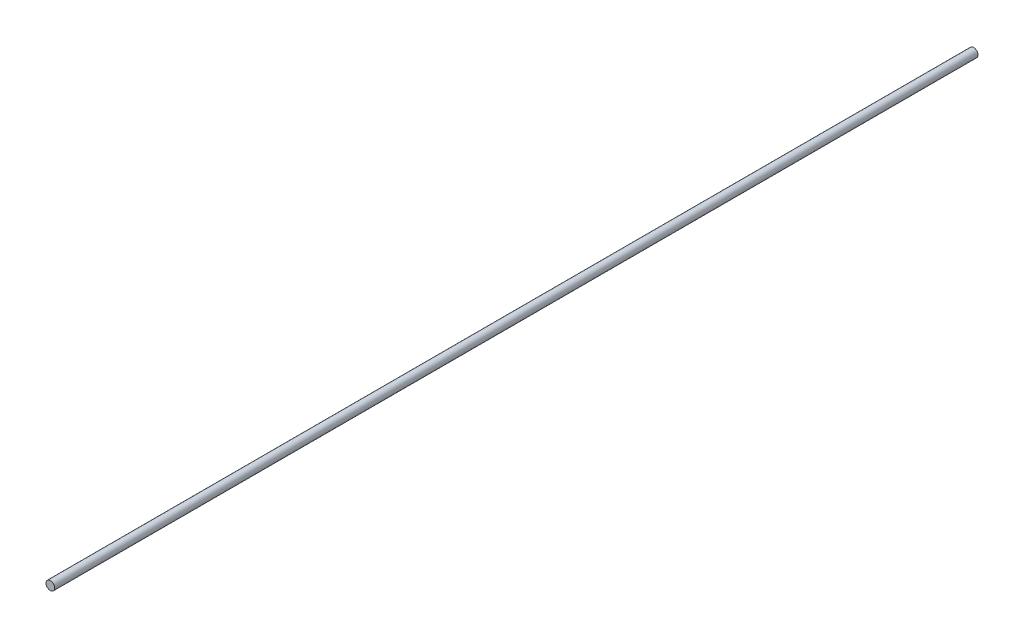
ISO-10303-21;
HEADER;
FILE_DESCRIPTION(('STEP AP214'),'2;1');
FILE_NAME('part.step','',(''),(''),'','','');
FILE_SCHEMA(('AUTOMOTIVE_DESIGN { 1 0 10303 214 1 1 1 1 }'));
ENDSEC;
DATA;
#1=APPLICATION_CONTEXT('core data for automotive mechanical design processes');
#2=APPLICATION_PROTOCOL_DEFINITION('international standard','automotive_design',2000,#1);
#3=PRODUCT_CONTEXT('',#1,'mechanical');
#4=PRODUCT('Part','Part','',(#3));
#5=PRODUCT_RELATED_PRODUCT_CATEGORY('part','',(#4));
#6=PRODUCT_DEFINITION_FORMATION('','',#4);
#7=PRODUCT_DEFINITION_CONTEXT('part definition',#1,'design');
#8=PRODUCT_DEFINITION('design','',#6,#7);
#9=PRODUCT_DEFINITION_SHAPE('','',#8);
#10=(LENGTH_UNIT() NAMED_UNIT(*) SI_UNIT(.MILLI.,.METRE.));
#11=(NAMED_UNIT(*) PLANE_ANGLE_UNIT() SI_UNIT($,.RADIAN.));
#12=(NAMED_UNIT(*) SI_UNIT($,.STERADIAN.) SOLID_ANGLE_UNIT());
#13=UNCERTAINTY_MEASURE_WITH_UNIT(LENGTH_MEASURE(1.E-05),#10,'distance_accuracy_value','');
#14=(GEOMETRIC_REPRESENTATION_CONTEXT(3) GLOBAL_UNCERTAINTY_ASSIGNED_CONTEXT((#13)) GLOBAL_UNIT_ASSIGNED_CONTEXT((#10,
#11,#12)) REPRESENTATION_CONTEXT('',''));
#15=CARTESIAN_POINT('',(0.,0.,0.));
#16=DIRECTION('',(0.,0.,1.));
#17=DIRECTION('',(1.,0.,0.));
#18=AXIS2_PLACEMENT_3D('',#15,#16,#17);
#19=CARTESIAN_POINT('',(0.,0.,320.));
#20=DIRECTION('',(0.,0.,-1.));
#21=DIRECTION('',(-1.,0.,0.));
#22=AXIS2_PLACEMENT_3D('',#19,#20,#21);
#23=CYLINDRICAL_SURFACE('',#22,1.5);
#24=CARTESIAN_POINT('',(0.,0.,320.));
#25=DIRECTION('',(0.,0.,1.));
#26=DIRECTION('',(1.,0.,0.));
#27=AXIS2_PLACEMENT_3D('',#24,#25,#26);
#28=CIRCLE('',#27,1.5);
#29=CARTESIAN_POINT('',(1.5,0.,320.));
#30=VERTEX_POINT('',#29);
#31=EDGE_CURVE('E10',#30,#30,#28,.T.);
#32=ORIENTED_EDGE('',*,*,#31,.F.);
#33=EDGE_LOOP('',(#32));
#34=FACE_BOUND('',#33,.T.);
#35=CARTESIAN_POINT('',(0.,0.,0.));
#36=DIRECTION('',(0.,0.,1.));
#37=DIRECTION('',(1.,0.,0.));
#38=AXIS2_PLACEMENT_3D('',#35,#36,#37);
#39=CIRCLE('',#38,1.5);
#40=CARTESIAN_POINT('',(1.5,0.,0.));
#41=VERTEX_POINT('',#40);
#42=EDGE_CURVE('E35',#41,#41,#39,.T.);
#43=ORIENTED_EDGE('',*,*,#42,.T.);
#44=EDGE_LOOP('',(#43));
#45=FACE_BOUND('',#44,.T.);
#46=ADVANCED_FACE('F32',(#34,#45),#23,.T.);
#47=CARTESIAN_POINT('',(0.,0.,320.));
#48=DIRECTION('',(0.,0.,1.));
#49=DIRECTION('',(1.,0.,0.));
#50=AXIS2_PLACEMENT_3D('',#47,#48,#49);
#51=PLANE('',#50);
#52=ORIENTED_EDGE('',*,*,#31,.T.);
#53=EDGE_LOOP('',(#52));
#54=FACE_BOUND('',#53,.T.);
#55=ADVANCED_FACE('F47',(#54),#51,.T.);
#56=CARTESIAN_POINT('',(0.,0.,0.));
#57=DIRECTION('',(0.,0.,1.));
#58=DIRECTION('',(1.,0.,0.));
#59=AXIS2_PLACEMENT_3D('',#56,#57,#58);
#60=PLANE('',#59);
#61=ORIENTED_EDGE('',*,*,#42,.F.);
#62=EDGE_LOOP('',(#61));
#63=FACE_BOUND('',#62,.T.);
#64=ADVANCED_FACE('F45',(#63),#60,.F.);
#65=CLOSED_SHELL('',(#46,#55,#64));
#66=MANIFOLD_SOLID_BREP('B2',#65);
#67=ADVANCED_BREP_SHAPE_REPRESENTATION('',(#18,#66),#14);
#68=SHAPE_DEFINITION_REPRESENTATION(#9,#67);
ENDSEC;
END-ISO-10303-21;
